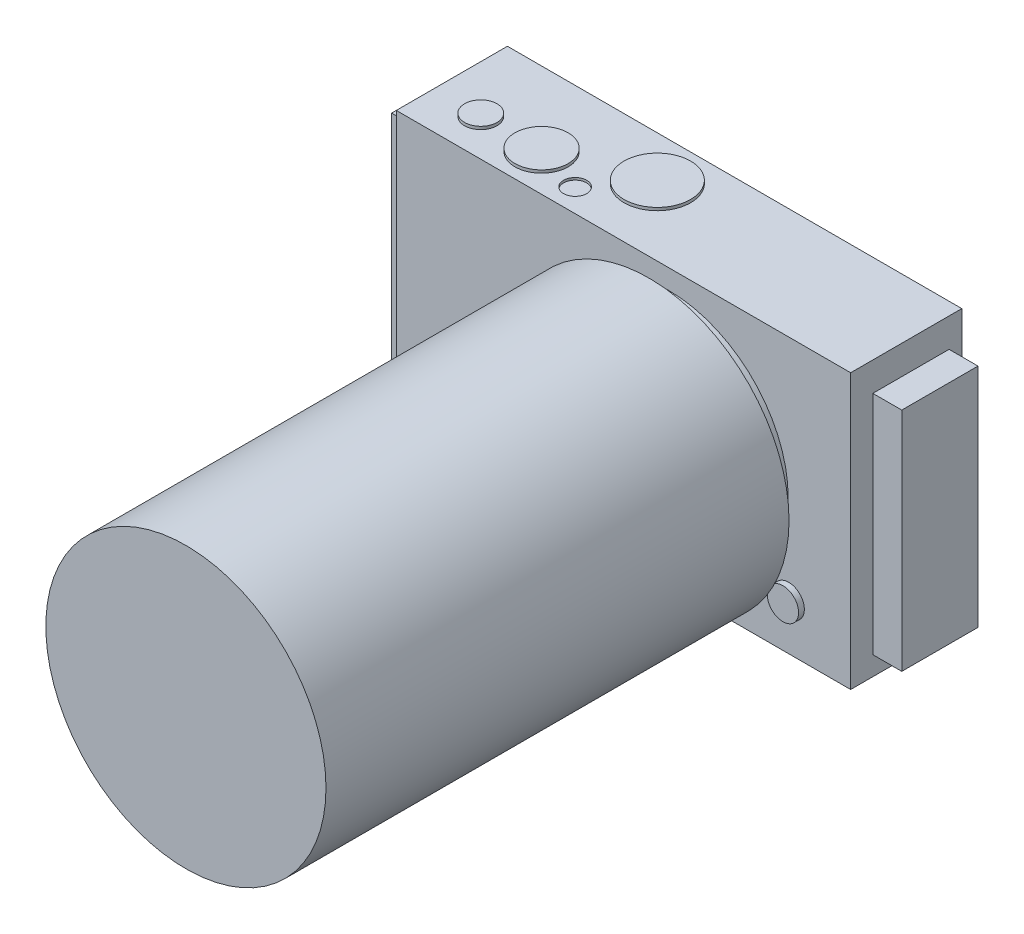
ISO-10303-21;
HEADER;
FILE_DESCRIPTION(('STEP AP214'),'2;1');
FILE_NAME('part.step','',(''),(''),'','','');
FILE_SCHEMA(('AUTOMOTIVE_DESIGN { 1 0 10303 214 1 1 1 1 }'));
ENDSEC;
DATA;
#1=APPLICATION_CONTEXT('core data for automotive mechanical design processes');
#2=APPLICATION_PROTOCOL_DEFINITION('international standard','automotive_design',2000,#1);
#3=PRODUCT_CONTEXT('',#1,'mechanical');
#4=PRODUCT('Part','Part','',(#3));
#5=PRODUCT_RELATED_PRODUCT_CATEGORY('part','',(#4));
#6=PRODUCT_DEFINITION_FORMATION('','',#4);
#7=PRODUCT_DEFINITION_CONTEXT('part definition',#1,'design');
#8=PRODUCT_DEFINITION('design','',#6,#7);
#9=PRODUCT_DEFINITION_SHAPE('','',#8);
#10=(LENGTH_UNIT() NAMED_UNIT(*) SI_UNIT(.MILLI.,.METRE.));
#11=(NAMED_UNIT(*) PLANE_ANGLE_UNIT() SI_UNIT($,.RADIAN.));
#12=(NAMED_UNIT(*) SI_UNIT($,.STERADIAN.) SOLID_ANGLE_UNIT());
#13=UNCERTAINTY_MEASURE_WITH_UNIT(LENGTH_MEASURE(1.E-05),#10,'distance_accuracy_value','');
#14=(GEOMETRIC_REPRESENTATION_CONTEXT(3) GLOBAL_UNCERTAINTY_ASSIGNED_CONTEXT((#13)) GLOBAL_UNIT_ASSIGNED_CONTEXT((#10,
#11,#12)) REPRESENTATION_CONTEXT('',''));
#15=CARTESIAN_POINT('',(0.,0.,0.));
#16=DIRECTION('',(0.,0.,1.));
#17=DIRECTION('',(1.,0.,0.));
#18=AXIS2_PLACEMENT_3D('',#15,#16,#17);
#19=CARTESIAN_POINT('',(99.695,0.,24.384));
#20=DIRECTION('',(-1.,0.,0.));
#21=DIRECTION('',(0.,0.,1.));
#22=AXIS2_PLACEMENT_3D('',#19,#20,#21);
#23=PLANE('',#22);
#24=DIRECTION('',(0.,1.,0.));
#25=VECTOR('',#24,1.);
#26=CARTESIAN_POINT('',(99.695,0.,0.));
#27=LINE('',#26,#25);
#28=CARTESIAN_POINT('',(99.695,0.,0.));
#29=VERTEX_POINT('',#28);
#30=CARTESIAN_POINT('',(99.695,60.198,0.));
#31=VERTEX_POINT('',#30);
#32=EDGE_CURVE('E224',#29,#31,#27,.T.);
#33=ORIENTED_EDGE('',*,*,#32,.T.);
#34=DIRECTION('',(0.,0.,-1.));
#35=VECTOR('',#34,1.);
#36=CARTESIAN_POINT('',(99.695,60.198,24.384));
#37=LINE('',#36,#35);
#38=CARTESIAN_POINT('',(99.695,60.198,24.384));
#39=VERTEX_POINT('',#38);
#40=EDGE_CURVE('E229',#39,#31,#37,.T.);
#41=ORIENTED_EDGE('',*,*,#40,.F.);
#42=DIRECTION('',(0.,1.,0.));
#43=VECTOR('',#42,1.);
#44=CARTESIAN_POINT('',(99.695,0.,24.384));
#45=LINE('',#44,#43);
#46=CARTESIAN_POINT('',(99.695,0.,24.384));
#47=VERTEX_POINT('',#46);
#48=EDGE_CURVE('E215',#47,#39,#45,.T.);
#49=ORIENTED_EDGE('',*,*,#48,.F.);
#50=DIRECTION('',(0.,0.,-1.));
#51=VECTOR('',#50,1.);
#52=CARTESIAN_POINT('',(99.695,0.,24.384));
#53=LINE('',#52,#51);
#54=EDGE_CURVE('E232',#47,#29,#53,.T.);
#55=ORIENTED_EDGE('',*,*,#54,.T.);
#56=EDGE_LOOP('',(#33,#41,#49,#55));
#57=FACE_BOUND('',#56,.T.);
#58=DIRECTION('',(0.,-1.,0.));
#59=VECTOR('',#58,1.);
#60=CARTESIAN_POINT('',(99.695,53.848,19.5203753590363));
#61=LINE('',#60,#59);
#62=CARTESIAN_POINT('',(99.695,53.848,19.5203753590363));
#63=VERTEX_POINT('',#62);
#64=CARTESIAN_POINT('',(99.695,4.191,19.5203753590363));
#65=VERTEX_POINT('',#64);
#66=EDGE_CURVE('E142',#63,#65,#61,.T.);
#67=ORIENTED_EDGE('',*,*,#66,.F.);
#68=DIRECTION('',(0.,0.,1.));
#69=VECTOR('',#68,1.);
#70=CARTESIAN_POINT('',(99.695,53.848,19.5203753590363));
#71=LINE('',#70,#69);
#72=CARTESIAN_POINT('',(99.695,53.848,2.794));
#73=VERTEX_POINT('',#72);
#74=EDGE_CURVE('E139',#73,#63,#71,.T.);
#75=ORIENTED_EDGE('',*,*,#74,.F.);
#76=DIRECTION('',(0.,1.,0.));
#77=VECTOR('',#76,1.);
#78=CARTESIAN_POINT('',(99.695,53.848,2.794));
#79=LINE('',#78,#77);
#80=CARTESIAN_POINT('',(99.695,4.191,2.79399999999999));
#81=VERTEX_POINT('',#80);
#82=EDGE_CURVE('E53',#81,#73,#79,.T.);
#83=ORIENTED_EDGE('',*,*,#82,.F.);
#84=DIRECTION('',(0.,0.,-1.));
#85=VECTOR('',#84,1.);
#86=CARTESIAN_POINT('',(99.695,4.191,19.5203753590363));
#87=LINE('',#86,#85);
#88=EDGE_CURVE('E48',#65,#81,#87,.T.);
#89=ORIENTED_EDGE('',*,*,#88,.F.);
#90=EDGE_LOOP('',(#67,#75,#83,#89));
#91=FACE_BOUND('',#90,.T.);
#92=ADVANCED_FACE('F33',(#57,#91),#23,.F.);
#93=CARTESIAN_POINT('',(0.,0.,24.384));
#94=DIRECTION('',(1.,0.,0.));
#95=DIRECTION('',(0.,0.,-1.));
#96=AXIS2_PLACEMENT_3D('',#93,#94,#95);
#97=PLANE('',#96);
#98=DIRECTION('',(0.,-1.,0.));
#99=VECTOR('',#98,1.);
#100=CARTESIAN_POINT('',(0.,0.,0.));
#101=LINE('',#100,#99);
#102=CARTESIAN_POINT('',(0.,60.198,0.));
#103=VERTEX_POINT('',#102);
#104=CARTESIAN_POINT('',(0.,0.,0.));
#105=VERTEX_POINT('',#104);
#106=EDGE_CURVE('E208',#103,#105,#101,.T.);
#107=ORIENTED_EDGE('',*,*,#106,.T.);
#108=DIRECTION('',(0.,0.,-1.));
#109=VECTOR('',#108,1.);
#110=CARTESIAN_POINT('',(0.,0.,24.384));
#111=LINE('',#110,#109);
#112=CARTESIAN_POINT('',(0.,0.,24.384));
#113=VERTEX_POINT('',#112);
#114=EDGE_CURVE('E235',#113,#105,#111,.T.);
#115=ORIENTED_EDGE('',*,*,#114,.F.);
#116=DIRECTION('',(0.,-1.,0.));
#117=VECTOR('',#116,1.);
#118=CARTESIAN_POINT('',(0.,0.,24.384));
#119=LINE('',#118,#117);
#120=CARTESIAN_POINT('',(0.,60.198,24.384));
#121=VERTEX_POINT('',#120);
#122=EDGE_CURVE('E209',#121,#113,#119,.T.);
#123=ORIENTED_EDGE('',*,*,#122,.F.);
#124=DIRECTION('',(0.,0.,-1.));
#125=VECTOR('',#124,1.);
#126=CARTESIAN_POINT('',(0.,60.198,24.384));
#127=LINE('',#126,#125);
#128=EDGE_CURVE('E219',#121,#103,#127,.T.);
#129=ORIENTED_EDGE('',*,*,#128,.T.);
#130=EDGE_LOOP('',(#107,#115,#123,#129));
#131=FACE_BOUND('',#130,.T.);
#132=DIRECTION('',(0.,-1.,0.));
#133=VECTOR('',#132,1.);
#134=CARTESIAN_POINT('',(0.,53.848,8.89));
#135=LINE('',#134,#133);
#136=CARTESIAN_POINT('',(0.,53.848,8.89));
#137=VERTEX_POINT('',#136);
#138=CARTESIAN_POINT('',(0.,2.032,8.89000000000001));
#139=VERTEX_POINT('',#138);
#140=EDGE_CURVE('E143',#137,#139,#135,.T.);
#141=ORIENTED_EDGE('',*,*,#140,.F.);
#142=DIRECTION('',(0.,0.,-1.));
#143=VECTOR('',#142,1.);
#144=CARTESIAN_POINT('',(0.,53.848,8.89));
#145=LINE('',#144,#143);
#146=CARTESIAN_POINT('',(0.,53.848,19.05));
#147=VERTEX_POINT('',#146);
#148=EDGE_CURVE('E156',#147,#137,#145,.T.);
#149=ORIENTED_EDGE('',*,*,#148,.F.);
#150=DIRECTION('',(0.,1.,0.));
#151=VECTOR('',#150,1.);
#152=CARTESIAN_POINT('',(0.,53.848,19.05));
#153=LINE('',#152,#151);
#154=CARTESIAN_POINT('',(0.,2.032,19.05));
#155=VERTEX_POINT('',#154);
#156=EDGE_CURVE('E165',#155,#147,#153,.T.);
#157=ORIENTED_EDGE('',*,*,#156,.F.);
#158=DIRECTION('',(0.,0.,1.));
#159=VECTOR('',#158,1.);
#160=CARTESIAN_POINT('',(0.,2.032,8.89000000000001));
#161=LINE('',#160,#159);
#162=EDGE_CURVE('E146',#139,#155,#161,.T.);
#163=ORIENTED_EDGE('',*,*,#162,.F.);
#164=EDGE_LOOP('',(#141,#149,#157,#163));
#165=FACE_BOUND('',#164,.T.);
#166=ADVANCED_FACE('F35',(#131,#165),#97,.F.);
#167=CARTESIAN_POINT('',(0.,0.,24.384));
#168=DIRECTION('',(0.,1.,0.));
#169=DIRECTION('',(0.,0.,1.));
#170=AXIS2_PLACEMENT_3D('',#167,#168,#169);
#171=PLANE('',#170);
#172=CARTESIAN_POINT('',(60.325,0.,14.224));
#173=DIRECTION('',(0.,-1.,0.));
#174=DIRECTION('',(0.,0.,-1.));
#175=AXIS2_PLACEMENT_3D('',#172,#173,#174);
#176=CIRCLE('',#175,3.175);
#177=CARTESIAN_POINT('',(60.325,0.,11.049));
#178=VERTEX_POINT('',#177);
#179=EDGE_CURVE('E181',#178,#178,#176,.T.);
#180=ORIENTED_EDGE('',*,*,#179,.F.);
#181=EDGE_LOOP('',(#180));
#182=FACE_BOUND('',#181,.T.);
#183=DIRECTION('',(1.,0.,0.));
#184=VECTOR('',#183,1.);
#185=CARTESIAN_POINT('',(0.,0.,0.));
#186=LINE('',#185,#184);
#187=EDGE_CURVE('E222',#105,#29,#186,.T.);
#188=ORIENTED_EDGE('',*,*,#187,.T.);
#189=ORIENTED_EDGE('',*,*,#54,.F.);
#190=DIRECTION('',(1.,0.,0.));
#191=VECTOR('',#190,1.);
#192=CARTESIAN_POINT('',(0.,0.,24.384));
#193=LINE('',#192,#191);
#194=EDGE_CURVE('E212',#113,#47,#193,.T.);
#195=ORIENTED_EDGE('',*,*,#194,.F.);
#196=ORIENTED_EDGE('',*,*,#114,.T.);
#197=EDGE_LOOP('',(#188,#189,#195,#196));
#198=FACE_BOUND('',#197,.T.);
#199=ADVANCED_FACE('F255',(#182,#198),#171,.F.);
#200=CARTESIAN_POINT('',(0.,60.198,24.384));
#201=DIRECTION('',(0.,-1.,0.));
#202=DIRECTION('',(0.,0.,-1.));
#203=AXIS2_PLACEMENT_3D('',#200,#201,#202);
#204=PLANE('',#203);
#205=CARTESIAN_POINT('',(34.163,60.198,19.304));
#206=DIRECTION('',(0.,1.,0.));
#207=DIRECTION('',(0.,0.,1.));
#208=AXIS2_PLACEMENT_3D('',#205,#206,#207);
#209=CIRCLE('',#208,2.54);
#210=CARTESIAN_POINT('',(34.163,60.198,21.844));
#211=VERTEX_POINT('',#210);
#212=EDGE_CURVE('E185',#211,#211,#209,.T.);
#213=ORIENTED_EDGE('',*,*,#212,.F.);
#214=EDGE_LOOP('',(#213));
#215=FACE_BOUND('',#214,.T.);
#216=CARTESIAN_POINT('',(42.545,60.198,9.652));
#217=DIRECTION('',(0.,-1.,0.));
#218=DIRECTION('',(0.,0.,-1.));
#219=AXIS2_PLACEMENT_3D('',#216,#217,#218);
#220=CIRCLE('',#219,7.3025);
#221=CARTESIAN_POINT('',(42.545,60.198,2.3495));
#222=VERTEX_POINT('',#221);
#223=EDGE_CURVE('E11',#222,#222,#220,.F.);
#224=ORIENTED_EDGE('',*,*,#223,.F.);
#225=EDGE_LOOP('',(#224));
#226=FACE_BOUND('',#225,.T.);
#227=CARTESIAN_POINT('',(23.749,60.198,16.256));
#228=DIRECTION('',(0.,-1.,0.));
#229=DIRECTION('',(0.,0.,-1.));
#230=AXIS2_PLACEMENT_3D('',#227,#228,#229);
#231=CIRCLE('',#230,5.842);
#232=CARTESIAN_POINT('',(23.749,60.198,10.414));
#233=VERTEX_POINT('',#232);
#234=EDGE_CURVE('E41',#233,#233,#231,.F.);
#235=ORIENTED_EDGE('',*,*,#234,.F.);
#236=EDGE_LOOP('',(#235));
#237=FACE_BOUND('',#236,.T.);
#238=CARTESIAN_POINT('',(10.414,60.198,16.256));
#239=DIRECTION('',(0.,-1.,0.));
#240=DIRECTION('',(0.,0.,-1.));
#241=AXIS2_PLACEMENT_3D('',#238,#239,#240);
#242=CIRCLE('',#241,3.556);
#243=CARTESIAN_POINT('',(10.414,60.198,12.7));
#244=VERTEX_POINT('',#243);
#245=EDGE_CURVE('E244',#244,#244,#242,.F.);
#246=ORIENTED_EDGE('',*,*,#245,.F.);
#247=EDGE_LOOP('',(#246));
#248=FACE_BOUND('',#247,.T.);
#249=DIRECTION('',(-1.,0.,0.));
#250=VECTOR('',#249,1.);
#251=CARTESIAN_POINT('',(0.,60.198,0.));
#252=LINE('',#251,#250);
#253=EDGE_CURVE('E213',#31,#103,#252,.T.);
#254=ORIENTED_EDGE('',*,*,#253,.T.);
#255=ORIENTED_EDGE('',*,*,#128,.F.);
#256=DIRECTION('',(-1.,0.,0.));
#257=VECTOR('',#256,1.);
#258=CARTESIAN_POINT('',(0.,60.198,24.384));
#259=LINE('',#258,#257);
#260=EDGE_CURVE('E217',#39,#121,#259,.T.);
#261=ORIENTED_EDGE('',*,*,#260,.F.);
#262=ORIENTED_EDGE('',*,*,#40,.T.);
#263=EDGE_LOOP('',(#254,#255,#261,#262));
#264=FACE_BOUND('',#263,.T.);
#265=ADVANCED_FACE('F251',(#215,#226,#237,#248,#264),#204,.F.);
#266=CARTESIAN_POINT('',(0.,0.,24.384));
#267=DIRECTION('',(0.,0.,-1.));
#268=DIRECTION('',(-1.,0.,0.));
#269=AXIS2_PLACEMENT_3D('',#266,#267,#268);
#270=PLANE('',#269);
#271=CARTESIAN_POINT('',(86.106,10.16,24.384));
#272=DIRECTION('',(0.,0.,-1.));
#273=DIRECTION('',(-1.,0.,0.));
#274=AXIS2_PLACEMENT_3D('',#271,#272,#273);
#275=CIRCLE('',#274,3.429);
#276=CARTESIAN_POINT('',(82.677,10.16,24.384));
#277=VERTEX_POINT('',#276);
#278=EDGE_CURVE('E241',#277,#277,#275,.F.);
#279=ORIENTED_EDGE('',*,*,#278,.F.);
#280=EDGE_LOOP('',(#279));
#281=FACE_BOUND('',#280,.T.);
#282=CARTESIAN_POINT('',(59.7587702550328,29.6545,24.384));
#283=DIRECTION('',(0.,0.,-1.));
#284=DIRECTION('',(-1.,0.,0.));
#285=AXIS2_PLACEMENT_3D('',#282,#283,#284);
#286=CIRCLE('',#285,26.2255);
#287=CARTESIAN_POINT('',(33.5332702550328,29.6545,24.384));
#288=VERTEX_POINT('',#287);
#289=EDGE_CURVE('E238',#288,#288,#286,.F.);
#290=ORIENTED_EDGE('',*,*,#289,.F.);
#291=EDGE_LOOP('',(#290));
#292=FACE_BOUND('',#291,.T.);
#293=ORIENTED_EDGE('',*,*,#122,.T.);
#294=ORIENTED_EDGE('',*,*,#194,.T.);
#295=ORIENTED_EDGE('',*,*,#48,.T.);
#296=ORIENTED_EDGE('',*,*,#260,.T.);
#297=EDGE_LOOP('',(#293,#294,#295,#296));
#298=FACE_BOUND('',#297,.T.);
#299=ADVANCED_FACE('F254',(#281,#292,#298),#270,.F.);
#300=CARTESIAN_POINT('',(0.,0.,0.));
#301=DIRECTION('',(0.,0.,-1.));
#302=DIRECTION('',(-1.,0.,0.));
#303=AXIS2_PLACEMENT_3D('',#300,#301,#302);
#304=PLANE('',#303);
#305=ORIENTED_EDGE('',*,*,#106,.F.);
#306=ORIENTED_EDGE('',*,*,#253,.F.);
#307=ORIENTED_EDGE('',*,*,#32,.F.);
#308=ORIENTED_EDGE('',*,*,#187,.F.);
#309=EDGE_LOOP('',(#305,#306,#307,#308));
#310=FACE_BOUND('',#309,.T.);
#311=ADVANCED_FACE('F271',(#310),#304,.T.);
#312=CARTESIAN_POINT('',(59.7587702550328,29.6545,28.702));
#313=DIRECTION('',(0.,0.,-1.));
#314=DIRECTION('',(-1.,0.,0.));
#315=AXIS2_PLACEMENT_3D('',#312,#313,#314);
#316=CYLINDRICAL_SURFACE('',#315,26.2255);
#317=CARTESIAN_POINT('',(59.7587702550328,29.6545,28.702));
#318=DIRECTION('',(0.,0.,1.));
#319=DIRECTION('',(1.,0.,0.));
#320=AXIS2_PLACEMENT_3D('',#317,#318,#319);
#321=CIRCLE('',#320,26.2255);
#322=CARTESIAN_POINT('',(85.9842702550328,29.6545,28.702));
#323=VERTEX_POINT('',#322);
#324=EDGE_CURVE('E205',#323,#323,#321,.T.);
#325=ORIENTED_EDGE('',*,*,#324,.F.);
#326=EDGE_LOOP('',(#325));
#327=FACE_BOUND('',#326,.T.);
#328=ORIENTED_EDGE('',*,*,#289,.T.);
#329=EDGE_LOOP('',(#328));
#330=FACE_BOUND('',#329,.T.);
#331=ADVANCED_FACE('F395',(#327,#330),#316,.T.);
#332=CARTESIAN_POINT('',(86.106,10.16,25.654));
#333=DIRECTION('',(0.,0.,-1.));
#334=DIRECTION('',(-1.,0.,0.));
#335=AXIS2_PLACEMENT_3D('',#332,#333,#334);
#336=CYLINDRICAL_SURFACE('',#335,3.429);
#337=CARTESIAN_POINT('',(86.106,10.16,25.654));
#338=DIRECTION('',(0.,0.,1.));
#339=DIRECTION('',(1.,0.,0.));
#340=AXIS2_PLACEMENT_3D('',#337,#338,#339);
#341=CIRCLE('',#340,3.429);
#342=CARTESIAN_POINT('',(89.535,10.16,25.654));
#343=VERTEX_POINT('',#342);
#344=EDGE_CURVE('E202',#343,#343,#341,.T.);
#345=ORIENTED_EDGE('',*,*,#344,.F.);
#346=EDGE_LOOP('',(#345));
#347=FACE_BOUND('',#346,.T.);
#348=ORIENTED_EDGE('',*,*,#278,.T.);
#349=EDGE_LOOP('',(#348));
#350=FACE_BOUND('',#349,.T.);
#351=ADVANCED_FACE('F391',(#347,#350),#336,.T.);
#352=CARTESIAN_POINT('',(86.106,10.16,25.654));
#353=DIRECTION('',(0.,0.,1.));
#354=DIRECTION('',(1.,0.,0.));
#355=AXIS2_PLACEMENT_3D('',#352,#353,#354);
#356=PLANE('',#355);
#357=ORIENTED_EDGE('',*,*,#344,.T.);
#358=EDGE_LOOP('',(#357));
#359=FACE_BOUND('',#358,.T.);
#360=ADVANCED_FACE('F387',(#359),#356,.T.);
#361=CARTESIAN_POINT('',(10.414,60.833,16.256));
#362=DIRECTION('',(0.,-1.,0.));
#363=DIRECTION('',(0.,0.,-1.));
#364=AXIS2_PLACEMENT_3D('',#361,#362,#363);
#365=CYLINDRICAL_SURFACE('',#364,3.556);
#366=CARTESIAN_POINT('',(10.414,60.833,16.256));
#367=DIRECTION('',(0.,1.,0.));
#368=DIRECTION('',(0.,0.,1.));
#369=AXIS2_PLACEMENT_3D('',#366,#367,#368);
#370=CIRCLE('',#369,3.556);
#371=CARTESIAN_POINT('',(10.414,60.833,19.812));
#372=VERTEX_POINT('',#371);
#373=EDGE_CURVE('E199',#372,#372,#370,.T.);
#374=ORIENTED_EDGE('',*,*,#373,.F.);
#375=EDGE_LOOP('',(#374));
#376=FACE_BOUND('',#375,.T.);
#377=ORIENTED_EDGE('',*,*,#245,.T.);
#378=EDGE_LOOP('',(#377));
#379=FACE_BOUND('',#378,.T.);
#380=ADVANCED_FACE('F383',(#376,#379),#365,.T.);
#381=CARTESIAN_POINT('',(10.414,60.833,16.256));
#382=DIRECTION('',(0.,1.,0.));
#383=DIRECTION('',(0.,0.,1.));
#384=AXIS2_PLACEMENT_3D('',#381,#382,#383);
#385=PLANE('',#384);
#386=ORIENTED_EDGE('',*,*,#373,.T.);
#387=EDGE_LOOP('',(#386));
#388=FACE_BOUND('',#387,.T.);
#389=ADVANCED_FACE('F379',(#388),#385,.T.);
#390=CARTESIAN_POINT('',(23.749,60.833,16.256));
#391=DIRECTION('',(0.,-1.,0.));
#392=DIRECTION('',(0.,0.,-1.));
#393=AXIS2_PLACEMENT_3D('',#390,#391,#392);
#394=CYLINDRICAL_SURFACE('',#393,5.842);
#395=CARTESIAN_POINT('',(23.749,60.833,16.256));
#396=DIRECTION('',(0.,1.,0.));
#397=DIRECTION('',(0.,0.,1.));
#398=AXIS2_PLACEMENT_3D('',#395,#396,#397);
#399=CIRCLE('',#398,5.842);
#400=CARTESIAN_POINT('',(23.749,60.833,22.098));
#401=VERTEX_POINT('',#400);
#402=EDGE_CURVE('E196',#401,#401,#399,.T.);
#403=ORIENTED_EDGE('',*,*,#402,.F.);
#404=EDGE_LOOP('',(#403));
#405=FACE_BOUND('',#404,.T.);
#406=ORIENTED_EDGE('',*,*,#234,.T.);
#407=EDGE_LOOP('',(#406));
#408=FACE_BOUND('',#407,.T.);
#409=ADVANCED_FACE('F249',(#405,#408),#394,.T.);
#410=CARTESIAN_POINT('',(23.749,60.833,16.256));
#411=DIRECTION('',(0.,1.,0.));
#412=DIRECTION('',(0.,0.,1.));
#413=AXIS2_PLACEMENT_3D('',#410,#411,#412);
#414=PLANE('',#413);
#415=ORIENTED_EDGE('',*,*,#402,.T.);
#416=EDGE_LOOP('',(#415));
#417=FACE_BOUND('',#416,.T.);
#418=ADVANCED_FACE('F372',(#417),#414,.T.);
#419=CARTESIAN_POINT('',(42.545,60.833,9.652));
#420=DIRECTION('',(0.,-1.,0.));
#421=DIRECTION('',(0.,0.,-1.));
#422=AXIS2_PLACEMENT_3D('',#419,#420,#421);
#423=CYLINDRICAL_SURFACE('',#422,7.3025);
#424=CARTESIAN_POINT('',(42.545,60.833,9.652));
#425=DIRECTION('',(0.,1.,0.));
#426=DIRECTION('',(0.,0.,1.));
#427=AXIS2_PLACEMENT_3D('',#424,#425,#426);
#428=CIRCLE('',#427,7.3025);
#429=CARTESIAN_POINT('',(42.545,60.833,16.9545));
#430=VERTEX_POINT('',#429);
#431=EDGE_CURVE('E191',#430,#430,#428,.T.);
#432=ORIENTED_EDGE('',*,*,#431,.F.);
#433=EDGE_LOOP('',(#432));
#434=FACE_BOUND('',#433,.T.);
#435=ORIENTED_EDGE('',*,*,#223,.T.);
#436=EDGE_LOOP('',(#435));
#437=FACE_BOUND('',#436,.T.);
#438=ADVANCED_FACE('F368',(#434,#437),#423,.T.);
#439=CARTESIAN_POINT('',(42.545,60.833,9.652));
#440=DIRECTION('',(0.,1.,0.));
#441=DIRECTION('',(0.,0.,1.));
#442=AXIS2_PLACEMENT_3D('',#439,#440,#441);
#443=PLANE('',#442);
#444=ORIENTED_EDGE('',*,*,#431,.T.);
#445=EDGE_LOOP('',(#444));
#446=FACE_BOUND('',#445,.T.);
#447=ADVANCED_FACE('F364',(#446),#443,.T.);
#448=CARTESIAN_POINT('',(34.163,59.69,19.304));
#449=DIRECTION('',(0.,1.,0.));
#450=DIRECTION('',(0.,0.,1.));
#451=AXIS2_PLACEMENT_3D('',#448,#449,#450);
#452=CYLINDRICAL_SURFACE('',#451,2.54);
#453=CARTESIAN_POINT('',(34.163,59.69,19.304));
#454=DIRECTION('',(0.,1.,0.));
#455=DIRECTION('',(0.,0.,1.));
#456=AXIS2_PLACEMENT_3D('',#453,#454,#455);
#457=CIRCLE('',#456,2.54);
#458=CARTESIAN_POINT('',(34.163,59.69,21.844));
#459=VERTEX_POINT('',#458);
#460=EDGE_CURVE('E188',#459,#459,#457,.T.);
#461=ORIENTED_EDGE('',*,*,#460,.F.);
#462=EDGE_LOOP('',(#461));
#463=FACE_BOUND('',#462,.T.);
#464=ORIENTED_EDGE('',*,*,#212,.T.);
#465=EDGE_LOOP('',(#464));
#466=FACE_BOUND('',#465,.T.);
#467=ADVANCED_FACE('F360',(#463,#466),#452,.F.);
#468=CARTESIAN_POINT('',(34.163,59.69,19.304));
#469=DIRECTION('',(0.,1.,0.));
#470=DIRECTION('',(0.,0.,1.));
#471=AXIS2_PLACEMENT_3D('',#468,#469,#470);
#472=PLANE('',#471);
#473=ORIENTED_EDGE('',*,*,#460,.T.);
#474=EDGE_LOOP('',(#473));
#475=FACE_BOUND('',#474,.T.);
#476=ADVANCED_FACE('F356',(#475),#472,.T.);
#477=CARTESIAN_POINT('',(60.325,6.604,14.224));
#478=DIRECTION('',(0.,-1.,0.));
#479=DIRECTION('',(0.,0.,-1.));
#480=AXIS2_PLACEMENT_3D('',#477,#478,#479);
#481=CYLINDRICAL_SURFACE('',#480,3.175);
#482=CARTESIAN_POINT('',(60.325,6.604,14.224));
#483=DIRECTION('',(0.,-1.,0.));
#484=DIRECTION('',(0.,0.,-1.));
#485=AXIS2_PLACEMENT_3D('',#482,#483,#484);
#486=CIRCLE('',#485,3.175);
#487=CARTESIAN_POINT('',(60.325,6.604,11.049));
#488=VERTEX_POINT('',#487);
#489=EDGE_CURVE('E182',#488,#488,#486,.T.);
#490=CARTESIAN_POINT('',(60.325,6.604,11.049));
#491=CARTESIAN_POINT('',(60.325,6.53520833333333,11.049));
#492=CARTESIAN_POINT('',(60.325,6.46641666666667,11.049));
#493=CARTESIAN_POINT('',(60.325,6.32883333333333,11.049));
#494=CARTESIAN_POINT('',(60.325,6.26004166666667,11.049));
#495=CARTESIAN_POINT('',(60.325,6.12245833333333,11.049));
#496=CARTESIAN_POINT('',(60.325,6.05366666666667,11.049));
#497=CARTESIAN_POINT('',(60.325,5.91608333333333,11.049));
#498=CARTESIAN_POINT('',(60.325,5.84729166666667,11.049));
#499=CARTESIAN_POINT('',(60.325,5.70970833333333,11.049));
#500=CARTESIAN_POINT('',(60.325,5.64091666666667,11.049));
#501=CARTESIAN_POINT('',(60.325,5.50333333333333,11.049));
#502=CARTESIAN_POINT('',(60.325,5.43454166666667,11.049));
#503=CARTESIAN_POINT('',(60.325,5.29695833333333,11.049));
#504=CARTESIAN_POINT('',(60.325,5.22816666666667,11.049));
#505=CARTESIAN_POINT('',(60.325,5.09058333333333,11.049));
#506=CARTESIAN_POINT('',(60.325,5.02179166666667,11.049));
#507=CARTESIAN_POINT('',(60.325,4.88420833333333,11.049));
#508=CARTESIAN_POINT('',(60.325,4.81541666666667,11.049));
#509=CARTESIAN_POINT('',(60.325,4.67783333333333,11.049));
#510=CARTESIAN_POINT('',(60.325,4.60904166666667,11.049));
#511=CARTESIAN_POINT('',(60.325,4.47145833333333,11.049));
#512=CARTESIAN_POINT('',(60.325,4.40266666666667,11.049));
#513=CARTESIAN_POINT('',(60.325,4.26508333333333,11.049));
#514=CARTESIAN_POINT('',(60.325,4.19629166666667,11.049));
#515=CARTESIAN_POINT('',(60.325,4.05870833333333,11.049));
#516=CARTESIAN_POINT('',(60.325,3.98991666666667,11.049));
#517=CARTESIAN_POINT('',(60.325,3.85233333333333,11.049));
#518=CARTESIAN_POINT('',(60.325,3.78354166666667,11.049));
#519=CARTESIAN_POINT('',(60.325,3.64595833333333,11.049));
#520=CARTESIAN_POINT('',(60.325,3.57716666666667,11.049));
#521=CARTESIAN_POINT('',(60.325,3.43958333333333,11.049));
#522=CARTESIAN_POINT('',(60.325,3.37079166666667,11.049));
#523=CARTESIAN_POINT('',(60.325,3.23320833333333,11.049));
#524=CARTESIAN_POINT('',(60.325,3.16441666666667,11.049));
#525=CARTESIAN_POINT('',(60.325,3.02683333333333,11.049));
#526=CARTESIAN_POINT('',(60.325,2.95804166666667,11.049));
#527=CARTESIAN_POINT('',(60.325,2.82045833333333,11.049));
#528=CARTESIAN_POINT('',(60.325,2.75166666666667,11.049));
#529=CARTESIAN_POINT('',(60.325,2.61408333333333,11.049));
#530=CARTESIAN_POINT('',(60.325,2.54529166666667,11.049));
#531=CARTESIAN_POINT('',(60.325,2.40770833333333,11.049));
#532=CARTESIAN_POINT('',(60.325,2.33891666666667,11.049));
#533=CARTESIAN_POINT('',(60.325,2.20133333333333,11.049));
#534=CARTESIAN_POINT('',(60.325,2.13254166666667,11.049));
#535=CARTESIAN_POINT('',(60.325,1.99495833333333,11.049));
#536=CARTESIAN_POINT('',(60.325,1.92616666666667,11.049));
#537=CARTESIAN_POINT('',(60.325,1.78858333333333,11.049));
#538=CARTESIAN_POINT('',(60.325,1.71979166666667,11.049));
#539=CARTESIAN_POINT('',(60.325,1.58220833333333,11.049));
#540=CARTESIAN_POINT('',(60.325,1.51341666666667,11.049));
#541=CARTESIAN_POINT('',(60.325,1.37583333333333,11.049));
#542=CARTESIAN_POINT('',(60.325,1.30704166666667,11.049));
#543=CARTESIAN_POINT('',(60.325,1.16945833333333,11.049));
#544=CARTESIAN_POINT('',(60.325,1.10066666666667,11.049));
#545=CARTESIAN_POINT('',(60.325,0.963083333333333,11.049));
#546=CARTESIAN_POINT('',(60.325,0.894291666666666,11.049));
#547=CARTESIAN_POINT('',(60.325,0.756708333333333,11.049));
#548=CARTESIAN_POINT('',(60.325,0.687916666666667,11.049));
#549=CARTESIAN_POINT('',(60.325,0.550333333333333,11.049));
#550=CARTESIAN_POINT('',(60.325,0.481541666666667,11.049));
#551=CARTESIAN_POINT('',(60.325,0.343958333333333,11.049));
#552=CARTESIAN_POINT('',(60.325,0.275166666666667,11.049));
#553=CARTESIAN_POINT('',(60.325,0.137583333333333,11.049));
#554=CARTESIAN_POINT('',(60.325,0.0687916666666666,11.049));
#555=CARTESIAN_POINT('',(60.325,0.,11.049));
#556=B_SPLINE_CURVE_WITH_KNOTS('',3,(#490,#491,#492,#493,#494,#495,#496,#497,#498,#499,#500,
#501,#502,#503,#504,#505,#506,#507,#508,#509,#510,#511,#512,#513,#514,#515,#516,#517,#518,#519,
#520,#521,#522,#523,#524,#525,#526,#527,#528,#529,#530,#531,#532,#533,#534,#535,#536,#537,#538,
#539,#540,#541,#542,#543,#544,#545,#546,#547,#548,#549,#550,#551,#552,#553,#554,#555),
.UNSPECIFIED.,.F.,.F.,(4,2,2,2,2,2,2,2,2,2,2,2,2,2,2,2,2,2,2,2,2,2,2,2,2,2,2,2,2,2,2,2,4),(0.,
0.206375,0.41275,0.619125,0.8255,1.031875,1.23825,1.444625,1.651,1.857375,2.06375,2.270125,
2.4765,2.682875,2.88925,3.095625,3.302,3.508375,3.71475,3.921125,4.1275,4.333875,4.54025,
4.746625,4.953,5.159375,5.36575,5.572125,5.7785,5.984875,6.19125,6.397625,6.604),.UNSPECIFIED.);
#557=EDGE_CURVE('BSEAM352',#488,#178,#556,.T.);
#558=ORIENTED_EDGE('',*,*,#489,.F.);
#559=ORIENTED_EDGE('',*,*,#179,.T.);
#560=ORIENTED_EDGE('',*,*,#557,.T.);
#561=ORIENTED_EDGE('',*,*,#557,.F.);
#562=EDGE_LOOP('',(#558,#560,#559,#561));
#563=FACE_BOUND('',#562,.T.);
#564=ADVANCED_FACE('F352',(#563),#481,.F.);
#565=CARTESIAN_POINT('',(60.325,6.604,14.224));
#566=DIRECTION('',(0.,-1.,0.));
#567=DIRECTION('',(0.,0.,-1.));
#568=AXIS2_PLACEMENT_3D('',#565,#566,#567);
#569=PLANE('',#568);
#570=ORIENTED_EDGE('',*,*,#489,.T.);
#571=EDGE_LOOP('',(#570));
#572=FACE_BOUND('',#571,.T.);
#573=ADVANCED_FACE('F348',(#572),#569,.T.);
#574=CARTESIAN_POINT('',(-6.35,53.848,8.89));
#575=DIRECTION('',(0.,0.,1.));
#576=DIRECTION('',(0.,-1.,0.));
#577=AXIS2_PLACEMENT_3D('',#574,#575,#576);
#578=PLANE('',#577);
#579=ORIENTED_EDGE('',*,*,#140,.T.);
#580=DIRECTION('',(1.,0.,0.));
#581=VECTOR('',#580,1.);
#582=CARTESIAN_POINT('',(-6.35,2.032,8.89000000000001));
#583=LINE('',#582,#581);
#584=CARTESIAN_POINT('',(-6.35,2.032,8.89000000000001));
#585=VERTEX_POINT('',#584);
#586=EDGE_CURVE('E178',#585,#139,#583,.T.);
#587=ORIENTED_EDGE('',*,*,#586,.F.);
#588=DIRECTION('',(0.,-1.,0.));
#589=VECTOR('',#588,1.);
#590=CARTESIAN_POINT('',(-6.35,53.848,8.89));
#591=LINE('',#590,#589);
#592=CARTESIAN_POINT('',(-6.35,53.848,8.89));
#593=VERTEX_POINT('',#592);
#594=EDGE_CURVE('E152',#593,#585,#591,.T.);
#595=ORIENTED_EDGE('',*,*,#594,.F.);
#596=DIRECTION('',(1.,0.,0.));
#597=VECTOR('',#596,1.);
#598=CARTESIAN_POINT('',(-6.35,53.848,8.89));
#599=LINE('',#598,#597);
#600=EDGE_CURVE('E161',#593,#137,#599,.T.);
#601=ORIENTED_EDGE('',*,*,#600,.T.);
#602=EDGE_LOOP('',(#579,#587,#595,#601));
#603=FACE_BOUND('',#602,.T.);
#604=ADVANCED_FACE('F344',(#603),#578,.F.);
#605=CARTESIAN_POINT('',(-6.35,2.032,8.89000000000001));
#606=DIRECTION('',(0.,1.,0.));
#607=DIRECTION('',(0.,0.,1.));
#608=AXIS2_PLACEMENT_3D('',#605,#606,#607);
#609=PLANE('',#608);
#610=ORIENTED_EDGE('',*,*,#162,.T.);
#611=DIRECTION('',(1.,0.,0.));
#612=VECTOR('',#611,1.);
#613=CARTESIAN_POINT('',(-6.35,2.032,19.05));
#614=LINE('',#613,#612);
#615=CARTESIAN_POINT('',(-6.35,2.032,19.05));
#616=VERTEX_POINT('',#615);
#617=EDGE_CURVE('E175',#616,#155,#614,.T.);
#618=ORIENTED_EDGE('',*,*,#617,.F.);
#619=DIRECTION('',(0.,0.,1.));
#620=VECTOR('',#619,1.);
#621=CARTESIAN_POINT('',(-6.35,2.032,8.89000000000001));
#622=LINE('',#621,#620);
#623=EDGE_CURVE('E155',#585,#616,#622,.T.);
#624=ORIENTED_EDGE('',*,*,#623,.F.);
#625=ORIENTED_EDGE('',*,*,#586,.T.);
#626=EDGE_LOOP('',(#610,#618,#624,#625));
#627=FACE_BOUND('',#626,.T.);
#628=ADVANCED_FACE('F340',(#627),#609,.F.);
#629=CARTESIAN_POINT('',(-6.35,53.848,19.05));
#630=DIRECTION('',(0.,0.,-1.));
#631=DIRECTION('',(0.,1.,0.));
#632=AXIS2_PLACEMENT_3D('',#629,#630,#631);
#633=PLANE('',#632);
#634=ORIENTED_EDGE('',*,*,#156,.T.);
#635=DIRECTION('',(1.,0.,0.));
#636=VECTOR('',#635,1.);
#637=CARTESIAN_POINT('',(-6.35,53.848,19.05));
#638=LINE('',#637,#636);
#639=CARTESIAN_POINT('',(-6.35,53.848,19.05));
#640=VERTEX_POINT('',#639);
#641=EDGE_CURVE('E172',#640,#147,#638,.T.);
#642=ORIENTED_EDGE('',*,*,#641,.F.);
#643=DIRECTION('',(0.,1.,0.));
#644=VECTOR('',#643,1.);
#645=CARTESIAN_POINT('',(-6.35,53.848,19.05));
#646=LINE('',#645,#644);
#647=EDGE_CURVE('E158',#616,#640,#646,.T.);
#648=ORIENTED_EDGE('',*,*,#647,.F.);
#649=ORIENTED_EDGE('',*,*,#617,.T.);
#650=EDGE_LOOP('',(#634,#642,#648,#649));
#651=FACE_BOUND('',#650,.T.);
#652=ADVANCED_FACE('F336',(#651),#633,.F.);
#653=CARTESIAN_POINT('',(-6.35,53.848,8.89));
#654=DIRECTION('',(0.,-1.,0.));
#655=DIRECTION('',(0.,0.,-1.));
#656=AXIS2_PLACEMENT_3D('',#653,#654,#655);
#657=PLANE('',#656);
#658=ORIENTED_EDGE('',*,*,#148,.T.);
#659=ORIENTED_EDGE('',*,*,#600,.F.);
#660=DIRECTION('',(0.,0.,-1.));
#661=VECTOR('',#660,1.);
#662=CARTESIAN_POINT('',(-6.35,53.848,8.89));
#663=LINE('',#662,#661);
#664=EDGE_CURVE('E160',#640,#593,#663,.T.);
#665=ORIENTED_EDGE('',*,*,#664,.F.);
#666=ORIENTED_EDGE('',*,*,#641,.T.);
#667=EDGE_LOOP('',(#658,#659,#665,#666));
#668=FACE_BOUND('',#667,.T.);
#669=ADVANCED_FACE('F332',(#668),#657,.F.);
#670=CARTESIAN_POINT('',(-6.35,0.,0.));
#671=DIRECTION('',(-1.,0.,0.));
#672=DIRECTION('',(0.,0.,1.));
#673=AXIS2_PLACEMENT_3D('',#670,#671,#672);
#674=PLANE('',#673);
#675=ORIENTED_EDGE('',*,*,#594,.T.);
#676=ORIENTED_EDGE('',*,*,#623,.T.);
#677=ORIENTED_EDGE('',*,*,#647,.T.);
#678=ORIENTED_EDGE('',*,*,#664,.T.);
#679=EDGE_LOOP('',(#675,#676,#677,#678));
#680=FACE_BOUND('',#679,.T.);
#681=ADVANCED_FACE('F329',(#680),#674,.T.);
#682=CARTESIAN_POINT('',(106.045,53.848,19.5203753590363));
#683=DIRECTION('',(0.,0.,-1.));
#684=DIRECTION('',(0.,1.,0.));
#685=AXIS2_PLACEMENT_3D('',#682,#683,#684);
#686=PLANE('',#685);
#687=ORIENTED_EDGE('',*,*,#66,.T.);
#688=DIRECTION('',(-1.,0.,0.));
#689=VECTOR('',#688,1.);
#690=CARTESIAN_POINT('',(106.045,4.191,19.5203753590363));
#691=LINE('',#690,#689);
#692=CARTESIAN_POINT('',(106.045,4.191,19.5203753590363));
#693=VERTEX_POINT('',#692);
#694=EDGE_CURVE('E123',#693,#65,#691,.T.);
#695=ORIENTED_EDGE('',*,*,#694,.F.);
#696=DIRECTION('',(0.,-1.,0.));
#697=VECTOR('',#696,1.);
#698=CARTESIAN_POINT('',(106.045,53.848,19.5203753590363));
#699=LINE('',#698,#697);
#700=CARTESIAN_POINT('',(106.045,53.848,19.5203753590363));
#701=VERTEX_POINT('',#700);
#702=EDGE_CURVE('E130',#701,#693,#699,.T.);
#703=ORIENTED_EDGE('',*,*,#702,.F.);
#704=DIRECTION('',(-1.,0.,0.));
#705=VECTOR('',#704,1.);
#706=CARTESIAN_POINT('',(106.045,53.848,19.5203753590363));
#707=LINE('',#706,#705);
#708=EDGE_CURVE('E285',#701,#63,#707,.T.);
#709=ORIENTED_EDGE('',*,*,#708,.T.);
#710=EDGE_LOOP('',(#687,#695,#703,#709));
#711=FACE_BOUND('',#710,.T.);
#712=ADVANCED_FACE('F141',(#711),#686,.F.);
#713=CARTESIAN_POINT('',(106.045,4.191,19.5203753590363));
#714=DIRECTION('',(0.,1.,0.));
#715=DIRECTION('',(0.,0.,1.));
#716=AXIS2_PLACEMENT_3D('',#713,#714,#715);
#717=PLANE('',#716);
#718=ORIENTED_EDGE('',*,*,#88,.T.);
#719=DIRECTION('',(-1.,0.,0.));
#720=VECTOR('',#719,1.);
#721=CARTESIAN_POINT('',(106.045,4.191,2.79399999999999));
#722=LINE('',#721,#720);
#723=CARTESIAN_POINT('',(106.045,4.191,2.79399999999999));
#724=VERTEX_POINT('',#723);
#725=EDGE_CURVE('E126',#724,#81,#722,.T.);
#726=ORIENTED_EDGE('',*,*,#725,.F.);
#727=DIRECTION('',(0.,0.,-1.));
#728=VECTOR('',#727,1.);
#729=CARTESIAN_POINT('',(106.045,4.191,19.5203753590363));
#730=LINE('',#729,#728);
#731=EDGE_CURVE('E119',#693,#724,#730,.T.);
#732=ORIENTED_EDGE('',*,*,#731,.F.);
#733=ORIENTED_EDGE('',*,*,#694,.T.);
#734=EDGE_LOOP('',(#718,#726,#732,#733));
#735=FACE_BOUND('',#734,.T.);
#736=ADVANCED_FACE('F121',(#735),#717,.F.);
#737=CARTESIAN_POINT('',(106.045,53.848,2.794));
#738=DIRECTION('',(0.,0.,1.));
#739=DIRECTION('',(0.,-1.,0.));
#740=AXIS2_PLACEMENT_3D('',#737,#738,#739);
#741=PLANE('',#740);
#742=ORIENTED_EDGE('',*,*,#82,.T.);
#743=DIRECTION('',(-1.,0.,0.));
#744=VECTOR('',#743,1.);
#745=CARTESIAN_POINT('',(106.045,53.848,2.794));
#746=LINE('',#745,#744);
#747=CARTESIAN_POINT('',(106.045,53.848,2.794));
#748=VERTEX_POINT('',#747);
#749=EDGE_CURVE('E148',#748,#73,#746,.T.);
#750=ORIENTED_EDGE('',*,*,#749,.F.);
#751=DIRECTION('',(0.,1.,0.));
#752=VECTOR('',#751,1.);
#753=CARTESIAN_POINT('',(106.045,53.848,2.794));
#754=LINE('',#753,#752);
#755=EDGE_CURVE('E129',#724,#748,#754,.T.);
#756=ORIENTED_EDGE('',*,*,#755,.F.);
#757=ORIENTED_EDGE('',*,*,#725,.T.);
#758=EDGE_LOOP('',(#742,#750,#756,#757));
#759=FACE_BOUND('',#758,.T.);
#760=ADVANCED_FACE('F321',(#759),#741,.F.);
#761=CARTESIAN_POINT('',(106.045,53.848,19.5203753590363));
#762=DIRECTION('',(0.,-1.,0.));
#763=DIRECTION('',(0.,0.,-1.));
#764=AXIS2_PLACEMENT_3D('',#761,#762,#763);
#765=PLANE('',#764);
#766=ORIENTED_EDGE('',*,*,#74,.T.);
#767=ORIENTED_EDGE('',*,*,#708,.F.);
#768=DIRECTION('',(0.,0.,1.));
#769=VECTOR('',#768,1.);
#770=CARTESIAN_POINT('',(106.045,53.848,19.5203753590363));
#771=LINE('',#770,#769);
#772=EDGE_CURVE('E135',#748,#701,#771,.T.);
#773=ORIENTED_EDGE('',*,*,#772,.F.);
#774=ORIENTED_EDGE('',*,*,#749,.T.);
#775=EDGE_LOOP('',(#766,#767,#773,#774));
#776=FACE_BOUND('',#775,.T.);
#777=ADVANCED_FACE('F284',(#776),#765,.F.);
#778=CARTESIAN_POINT('',(106.045,0.,0.));
#779=DIRECTION('',(1.,0.,0.));
#780=DIRECTION('',(0.,0.,-1.));
#781=AXIS2_PLACEMENT_3D('',#778,#779,#780);
#782=PLANE('',#781);
#783=ORIENTED_EDGE('',*,*,#702,.T.);
#784=ORIENTED_EDGE('',*,*,#731,.T.);
#785=ORIENTED_EDGE('',*,*,#755,.T.);
#786=ORIENTED_EDGE('',*,*,#772,.T.);
#787=EDGE_LOOP('',(#783,#784,#785,#786));
#788=FACE_BOUND('',#787,.T.);
#789=ADVANCED_FACE('F133',(#788),#782,.T.);
#790=CARTESIAN_POINT('',(59.7587702550328,29.6545,130.302));
#791=DIRECTION('',(0.,0.,-1.));
#792=DIRECTION('',(-1.,0.,0.));
#793=AXIS2_PLACEMENT_3D('',#790,#791,#792);
#794=CYLINDRICAL_SURFACE('',#793,30.734);
#795=CARTESIAN_POINT('',(59.7587702550328,29.6545,130.302));
#796=DIRECTION('',(0.,0.,1.));
#797=DIRECTION('',(1.,0.,0.));
#798=AXIS2_PLACEMENT_3D('',#795,#796,#797);
#799=CIRCLE('',#798,30.734);
#800=CARTESIAN_POINT('',(90.4927702550328,29.6545,130.302));
#801=VERTEX_POINT('',#800);
#802=EDGE_CURVE('E280',#801,#801,#799,.T.);
#803=ORIENTED_EDGE('',*,*,#802,.F.);
#804=EDGE_LOOP('',(#803));
#805=FACE_BOUND('',#804,.T.);
#806=CARTESIAN_POINT('',(59.7587702550328,29.6545,28.702));
#807=DIRECTION('',(0.,0.,1.));
#808=DIRECTION('',(1.,0.,0.));
#809=AXIS2_PLACEMENT_3D('',#806,#807,#808);
#810=CIRCLE('',#809,30.734);
#811=CARTESIAN_POINT('',(90.4927702550328,29.6545,28.702));
#812=VERTEX_POINT('',#811);
#813=EDGE_CURVE('E294',#812,#812,#810,.T.);
#814=ORIENTED_EDGE('',*,*,#813,.T.);
#815=EDGE_LOOP('',(#814));
#816=FACE_BOUND('',#815,.T.);
#817=ADVANCED_FACE('F302',(#805,#816),#794,.T.);
#818=CARTESIAN_POINT('',(59.7587702550328,29.6545,130.302));
#819=DIRECTION('',(0.,0.,1.));
#820=DIRECTION('',(1.,0.,0.));
#821=AXIS2_PLACEMENT_3D('',#818,#819,#820);
#822=PLANE('',#821);
#823=ORIENTED_EDGE('',*,*,#802,.T.);
#824=EDGE_LOOP('',(#823));
#825=FACE_BOUND('',#824,.T.);
#826=ADVANCED_FACE('F300',(#825),#822,.T.);
#827=CARTESIAN_POINT('',(59.7587702550328,29.6545,28.702));
#828=DIRECTION('',(0.,0.,1.));
#829=DIRECTION('',(1.,0.,0.));
#830=AXIS2_PLACEMENT_3D('',#827,#828,#829);
#831=PLANE('',#830);
#832=ORIENTED_EDGE('',*,*,#324,.T.);
#833=EDGE_LOOP('',(#832));
#834=FACE_BOUND('',#833,.T.);
#835=ORIENTED_EDGE('',*,*,#813,.F.);
#836=EDGE_LOOP('',(#835));
#837=FACE_BOUND('',#836,.T.);
#838=ADVANCED_FACE('F308',(#834,#837),#831,.F.);
#839=CLOSED_SHELL('',(#92,#166,#199,#265,#299,#311,#331,#351,#360,#380,#389,#409,#418,#438,#447,
#467,#476,#564,#573,#604,#628,#652,#669,#681,#712,#736,#760,#777,#789,#817,#826,#838));
#840=MANIFOLD_SOLID_BREP('B2',#839);
#841=ADVANCED_BREP_SHAPE_REPRESENTATION('',(#18,#840),#14);
#842=SHAPE_DEFINITION_REPRESENTATION(#9,#841);
ENDSEC;
END-ISO-10303-21;
